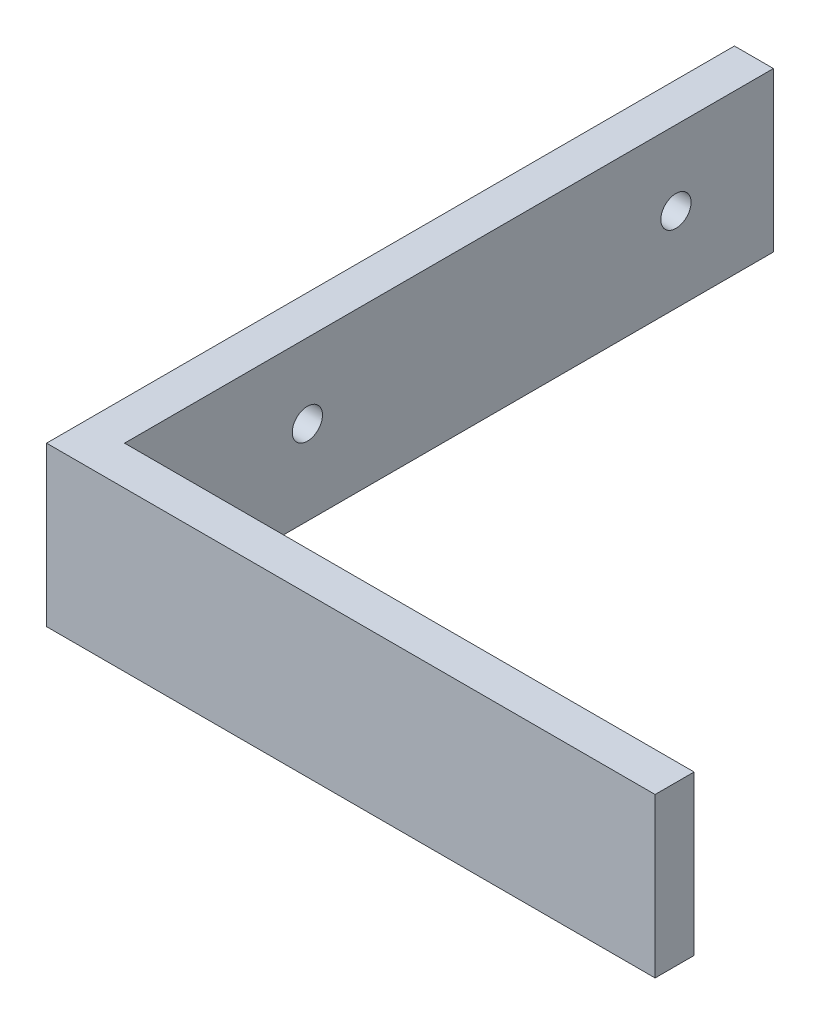
ISO-10303-21;
HEADER;
FILE_DESCRIPTION(('STEP AP214'),'2;1');
FILE_NAME('part.step','',(''),(''),'','','');
FILE_SCHEMA(('AUTOMOTIVE_DESIGN { 1 0 10303 214 1 1 1 1 }'));
ENDSEC;
DATA;
#1=APPLICATION_CONTEXT('core data for automotive mechanical design processes');
#2=APPLICATION_PROTOCOL_DEFINITION('international standard','automotive_design',2000,#1);
#3=PRODUCT_CONTEXT('',#1,'mechanical');
#4=PRODUCT('Part','Part','',(#3));
#5=PRODUCT_RELATED_PRODUCT_CATEGORY('part','',(#4));
#6=PRODUCT_DEFINITION_FORMATION('','',#4);
#7=PRODUCT_DEFINITION_CONTEXT('part definition',#1,'design');
#8=PRODUCT_DEFINITION('design','',#6,#7);
#9=PRODUCT_DEFINITION_SHAPE('','',#8);
#10=(LENGTH_UNIT() NAMED_UNIT(*) SI_UNIT(.MILLI.,.METRE.));
#11=(NAMED_UNIT(*) PLANE_ANGLE_UNIT() SI_UNIT($,.RADIAN.));
#12=(NAMED_UNIT(*) SI_UNIT($,.STERADIAN.) SOLID_ANGLE_UNIT());
#13=UNCERTAINTY_MEASURE_WITH_UNIT(LENGTH_MEASURE(1.E-05),#10,'distance_accuracy_value','');
#14=(GEOMETRIC_REPRESENTATION_CONTEXT(3) GLOBAL_UNCERTAINTY_ASSIGNED_CONTEXT((#13)) GLOBAL_UNIT_ASSIGNED_CONTEXT((#10,
#11,#12)) REPRESENTATION_CONTEXT('',''));
#15=CARTESIAN_POINT('',(0.,0.,0.));
#16=DIRECTION('',(0.,0.,1.));
#17=DIRECTION('',(1.,0.,0.));
#18=AXIS2_PLACEMENT_3D('',#15,#16,#17);
#19=CARTESIAN_POINT('',(-35.15,0.,4.));
#20=DIRECTION('',(1.,0.,0.));
#21=DIRECTION('',(0.,0.,-1.));
#22=AXIS2_PLACEMENT_3D('',#19,#20,#21);
#23=PLANE('',#22);
#24=DIRECTION('',(0.,0.,-1.));
#25=VECTOR('',#24,1.);
#26=CARTESIAN_POINT('',(-35.15,8.15,4.));
#27=LINE('',#26,#25);
#28=CARTESIAN_POINT('',(-35.15,8.15,4.));
#29=VERTEX_POINT('',#28);
#30=CARTESIAN_POINT('',(-35.15,8.14999999999999,-66.5500000000005));
#31=VERTEX_POINT('',#30);
#32=EDGE_CURVE('E115',#29,#31,#27,.T.);
#33=ORIENTED_EDGE('',*,*,#32,.T.);
#34=DIRECTION('',(0.,-1.,0.));
#35=VECTOR('',#34,1.);
#36=CARTESIAN_POINT('',(-35.15,8.14999999999999,-66.5500000000005));
#37=LINE('',#36,#35);
#38=CARTESIAN_POINT('',(-35.15,-8.15000000000001,-66.5500000000005));
#39=VERTEX_POINT('',#38);
#40=EDGE_CURVE('E145',#31,#39,#37,.T.);
#41=ORIENTED_EDGE('',*,*,#40,.T.);
#42=DIRECTION('',(0.,0.,-1.));
#43=VECTOR('',#42,1.);
#44=CARTESIAN_POINT('',(-35.15,-8.15,4.));
#45=LINE('',#44,#43);
#46=CARTESIAN_POINT('',(-35.15,-8.15,4.));
#47=VERTEX_POINT('',#46);
#48=EDGE_CURVE('E125',#47,#39,#45,.T.);
#49=ORIENTED_EDGE('',*,*,#48,.F.);
#50=DIRECTION('',(0.,-1.,0.));
#51=VECTOR('',#50,1.);
#52=CARTESIAN_POINT('',(-35.15,0.,4.));
#53=LINE('',#52,#51);
#54=EDGE_CURVE('E118',#29,#47,#53,.T.);
#55=ORIENTED_EDGE('',*,*,#54,.F.);
#56=EDGE_LOOP('',(#33,#41,#49,#55));
#57=FACE_BOUND('',#56,.T.);
#58=CARTESIAN_POINT('',(-35.15,0.499999999999778,-18.7500000000005));
#59=DIRECTION('',(-1.,0.,0.));
#60=DIRECTION('',(0.,0.,1.));
#61=AXIS2_PLACEMENT_3D('',#58,#59,#60);
#62=CIRCLE('',#61,1.55);
#63=CARTESIAN_POINT('',(-35.15,0.499999999999778,-17.2000000000005));
#64=VERTEX_POINT('',#63);
#65=EDGE_CURVE('E161',#64,#64,#62,.T.);
#66=ORIENTED_EDGE('',*,*,#65,.F.);
#67=EDGE_LOOP('',(#66));
#68=FACE_BOUND('',#67,.T.);
#69=CARTESIAN_POINT('',(-35.15,0.499999999999778,-56.5500000000005));
#70=DIRECTION('',(-1.,0.,0.));
#71=DIRECTION('',(0.,0.,1.));
#72=AXIS2_PLACEMENT_3D('',#69,#70,#71);
#73=CIRCLE('',#72,1.55);
#74=CARTESIAN_POINT('',(-35.15,0.499999999999778,-55.0000000000005));
#75=VERTEX_POINT('',#74);
#76=EDGE_CURVE('E155',#75,#75,#73,.T.);
#77=ORIENTED_EDGE('',*,*,#76,.F.);
#78=EDGE_LOOP('',(#77));
#79=FACE_BOUND('',#78,.T.);
#80=ADVANCED_FACE('F60',(#57,#68,#79),#23,.F.);
#81=CARTESIAN_POINT('',(27.2634,0.,4.));
#82=DIRECTION('',(-1.,0.,0.));
#83=DIRECTION('',(0.,0.,1.));
#84=AXIS2_PLACEMENT_3D('',#81,#82,#83);
#85=PLANE('',#84);
#86=DIRECTION('',(0.,1.,0.));
#87=VECTOR('',#86,1.);
#88=CARTESIAN_POINT('',(27.2634,0.,0.));
#89=LINE('',#88,#87);
#90=CARTESIAN_POINT('',(27.2634,-8.15,0.));
#91=VERTEX_POINT('',#90);
#92=CARTESIAN_POINT('',(27.2634,8.15000000000001,0.));
#93=VERTEX_POINT('',#92);
#94=EDGE_CURVE('E124',#91,#93,#89,.T.);
#95=ORIENTED_EDGE('',*,*,#94,.T.);
#96=DIRECTION('',(0.,0.,-1.));
#97=VECTOR('',#96,1.);
#98=CARTESIAN_POINT('',(27.2634,8.15000000000001,4.));
#99=LINE('',#98,#97);
#100=CARTESIAN_POINT('',(27.2634,8.15000000000001,4.));
#101=VERTEX_POINT('',#100);
#102=EDGE_CURVE('E69',#101,#93,#99,.T.);
#103=ORIENTED_EDGE('',*,*,#102,.F.);
#104=DIRECTION('',(0.,1.,0.));
#105=VECTOR('',#104,1.);
#106=CARTESIAN_POINT('',(27.2634,0.,4.));
#107=LINE('',#106,#105);
#108=CARTESIAN_POINT('',(27.2634,-8.15,4.));
#109=VERTEX_POINT('',#108);
#110=EDGE_CURVE('E119',#109,#101,#107,.T.);
#111=ORIENTED_EDGE('',*,*,#110,.F.);
#112=DIRECTION('',(0.,0.,-1.));
#113=VECTOR('',#112,1.);
#114=CARTESIAN_POINT('',(27.2634,-8.15,4.));
#115=LINE('',#114,#113);
#116=EDGE_CURVE('E12',#109,#91,#115,.T.);
#117=ORIENTED_EDGE('',*,*,#116,.T.);
#118=EDGE_LOOP('',(#95,#103,#111,#117));
#119=FACE_BOUND('',#118,.T.);
#120=ADVANCED_FACE('F123',(#119),#85,.F.);
#121=CARTESIAN_POINT('',(0.,8.15,4.));
#122=DIRECTION('',(0.,1.,0.));
#123=DIRECTION('',(-1.,0.,0.));
#124=AXIS2_PLACEMENT_3D('',#121,#122,#123);
#125=PLANE('',#124);
#126=DIRECTION('',(1.,0.,0.));
#127=VECTOR('',#126,1.);
#128=CARTESIAN_POINT('',(0.,8.15,0.));
#129=LINE('',#128,#127);
#130=CARTESIAN_POINT('',(-31.15,8.15,0.));
#131=VERTEX_POINT('',#130);
#132=EDGE_CURVE('E129',#131,#93,#129,.T.);
#133=ORIENTED_EDGE('',*,*,#132,.F.);
#134=DIRECTION('',(0.,0.,-1.));
#135=VECTOR('',#134,1.);
#136=CARTESIAN_POINT('',(-31.15,8.15,4.));
#137=LINE('',#136,#135);
#138=CARTESIAN_POINT('',(-31.15,8.14999999999999,-66.5500000000005));
#139=VERTEX_POINT('',#138);
#140=EDGE_CURVE('E98',#131,#139,#137,.T.);
#141=ORIENTED_EDGE('',*,*,#140,.T.);
#142=DIRECTION('',(-1.,0.,0.));
#143=VECTOR('',#142,1.);
#144=CARTESIAN_POINT('',(-31.15,8.14999999999999,-66.5500000000005));
#145=LINE('',#144,#143);
#146=EDGE_CURVE('E140',#139,#31,#145,.T.);
#147=ORIENTED_EDGE('',*,*,#146,.T.);
#148=ORIENTED_EDGE('',*,*,#32,.F.);
#149=DIRECTION('',(1.,0.,0.));
#150=VECTOR('',#149,1.);
#151=CARTESIAN_POINT('',(0.,8.15,4.));
#152=LINE('',#151,#150);
#153=EDGE_CURVE('E108',#29,#101,#152,.T.);
#154=ORIENTED_EDGE('',*,*,#153,.T.);
#155=ORIENTED_EDGE('',*,*,#102,.T.);
#156=EDGE_LOOP('',(#133,#141,#147,#148,#154,#155));
#157=FACE_BOUND('',#156,.T.);
#158=ADVANCED_FACE('F111',(#157),#125,.T.);
#159=CARTESIAN_POINT('',(0.,-8.15,4.));
#160=DIRECTION('',(0.,-1.,0.));
#161=DIRECTION('',(1.,0.,0.));
#162=AXIS2_PLACEMENT_3D('',#159,#160,#161);
#163=PLANE('',#162);
#164=DIRECTION('',(-1.,0.,0.));
#165=VECTOR('',#164,1.);
#166=CARTESIAN_POINT('',(0.,-8.15,4.));
#167=LINE('',#166,#165);
#168=EDGE_CURVE('E77',#109,#47,#167,.T.);
#169=ORIENTED_EDGE('',*,*,#168,.T.);
#170=ORIENTED_EDGE('',*,*,#48,.T.);
#171=DIRECTION('',(-1.,0.,0.));
#172=VECTOR('',#171,1.);
#173=CARTESIAN_POINT('',(-31.15,-8.15000000000001,-66.5500000000005));
#174=LINE('',#173,#172);
#175=CARTESIAN_POINT('',(-31.15,-8.15000000000001,-66.5500000000005));
#176=VERTEX_POINT('',#175);
#177=EDGE_CURVE('E139',#176,#39,#174,.T.);
#178=ORIENTED_EDGE('',*,*,#177,.F.);
#179=DIRECTION('',(0.,0.,1.));
#180=VECTOR('',#179,1.);
#181=CARTESIAN_POINT('',(-31.15,-8.15,4.));
#182=LINE('',#181,#180);
#183=CARTESIAN_POINT('',(-31.15,-8.15,0.));
#184=VERTEX_POINT('',#183);
#185=EDGE_CURVE('E142',#176,#184,#182,.T.);
#186=ORIENTED_EDGE('',*,*,#185,.T.);
#187=DIRECTION('',(-1.,0.,0.));
#188=VECTOR('',#187,1.);
#189=CARTESIAN_POINT('',(0.,-8.15,0.));
#190=LINE('',#189,#188);
#191=EDGE_CURVE('E132',#91,#184,#190,.T.);
#192=ORIENTED_EDGE('',*,*,#191,.F.);
#193=ORIENTED_EDGE('',*,*,#116,.F.);
#194=EDGE_LOOP('',(#169,#170,#178,#186,#192,#193));
#195=FACE_BOUND('',#194,.T.);
#196=ADVANCED_FACE('F62',(#195),#163,.T.);
#197=CARTESIAN_POINT('',(0.,0.,0.));
#198=DIRECTION('',(0.,0.,1.));
#199=DIRECTION('',(1.,0.,0.));
#200=AXIS2_PLACEMENT_3D('',#197,#198,#199);
#201=PLANE('',#200);
#202=ORIENTED_EDGE('',*,*,#191,.T.);
#203=DIRECTION('',(0.,1.,0.));
#204=VECTOR('',#203,1.);
#205=CARTESIAN_POINT('',(-31.15,0.,0.));
#206=LINE('',#205,#204);
#207=EDGE_CURVE('E135',#184,#131,#206,.T.);
#208=ORIENTED_EDGE('',*,*,#207,.T.);
#209=ORIENTED_EDGE('',*,*,#132,.T.);
#210=ORIENTED_EDGE('',*,*,#94,.F.);
#211=EDGE_LOOP('',(#202,#208,#209,#210));
#212=FACE_BOUND('',#211,.T.);
#213=ADVANCED_FACE('F198',(#212),#201,.F.);
#214=CARTESIAN_POINT('',(0.,0.,4.));
#215=DIRECTION('',(0.,0.,1.));
#216=DIRECTION('',(1.,0.,0.));
#217=AXIS2_PLACEMENT_3D('',#214,#215,#216);
#218=PLANE('',#217);
#219=ORIENTED_EDGE('',*,*,#110,.T.);
#220=ORIENTED_EDGE('',*,*,#153,.F.);
#221=ORIENTED_EDGE('',*,*,#54,.T.);
#222=ORIENTED_EDGE('',*,*,#168,.F.);
#223=EDGE_LOOP('',(#219,#220,#221,#222));
#224=FACE_BOUND('',#223,.T.);
#225=ADVANCED_FACE('F121',(#224),#218,.T.);
#226=CARTESIAN_POINT('',(-31.15,0.,0.));
#227=DIRECTION('',(1.,0.,0.));
#228=DIRECTION('',(0.,0.,-1.));
#229=AXIS2_PLACEMENT_3D('',#226,#227,#228);
#230=PLANE('',#229);
#231=CARTESIAN_POINT('',(-31.15,0.499999999999778,-56.5500000000005));
#232=DIRECTION('',(-1.,0.,0.));
#233=DIRECTION('',(0.,0.,1.));
#234=AXIS2_PLACEMENT_3D('',#231,#232,#233);
#235=CIRCLE('',#234,1.55);
#236=CARTESIAN_POINT('',(-31.15,0.499999999999778,-55.0000000000005));
#237=VERTEX_POINT('',#236);
#238=EDGE_CURVE('E148',#237,#237,#235,.T.);
#239=ORIENTED_EDGE('',*,*,#238,.T.);
#240=EDGE_LOOP('',(#239));
#241=FACE_BOUND('',#240,.T.);
#242=CARTESIAN_POINT('',(-31.15,0.499999999999778,-18.7500000000005));
#243=DIRECTION('',(-1.,0.,0.));
#244=DIRECTION('',(0.,0.,1.));
#245=AXIS2_PLACEMENT_3D('',#242,#243,#244);
#246=CIRCLE('',#245,1.55);
#247=CARTESIAN_POINT('',(-31.15,0.499999999999778,-17.2000000000005));
#248=VERTEX_POINT('',#247);
#249=EDGE_CURVE('E158',#248,#248,#246,.T.);
#250=ORIENTED_EDGE('',*,*,#249,.T.);
#251=EDGE_LOOP('',(#250));
#252=FACE_BOUND('',#251,.T.);
#253=ORIENTED_EDGE('',*,*,#207,.F.);
#254=ORIENTED_EDGE('',*,*,#185,.F.);
#255=DIRECTION('',(0.,-1.,0.));
#256=VECTOR('',#255,1.);
#257=CARTESIAN_POINT('',(-31.15,8.14999999999999,-66.5500000000005));
#258=LINE('',#257,#256);
#259=EDGE_CURVE('E151',#139,#176,#258,.T.);
#260=ORIENTED_EDGE('',*,*,#259,.F.);
#261=ORIENTED_EDGE('',*,*,#140,.F.);
#262=EDGE_LOOP('',(#253,#254,#260,#261));
#263=FACE_BOUND('',#262,.T.);
#264=ADVANCED_FACE('F167',(#241,#252,#263),#230,.T.);
#265=CARTESIAN_POINT('',(-31.15,8.14999999999999,-66.5500000000005));
#266=DIRECTION('',(0.,0.,-1.));
#267=DIRECTION('',(-1.,0.,0.));
#268=AXIS2_PLACEMENT_3D('',#265,#266,#267);
#269=PLANE('',#268);
#270=ORIENTED_EDGE('',*,*,#40,.F.);
#271=ORIENTED_EDGE('',*,*,#146,.F.);
#272=ORIENTED_EDGE('',*,*,#259,.T.);
#273=ORIENTED_EDGE('',*,*,#177,.T.);
#274=EDGE_LOOP('',(#270,#271,#272,#273));
#275=FACE_BOUND('',#274,.T.);
#276=ADVANCED_FACE('F183',(#275),#269,.T.);
#277=CARTESIAN_POINT('',(-31.15,0.499999999999778,-56.5500000000005));
#278=DIRECTION('',(-1.,0.,0.));
#279=DIRECTION('',(0.,0.,1.));
#280=AXIS2_PLACEMENT_3D('',#277,#278,#279);
#281=CYLINDRICAL_SURFACE('',#280,1.55);
#282=ORIENTED_EDGE('',*,*,#238,.F.);
#283=EDGE_LOOP('',(#282));
#284=FACE_BOUND('',#283,.T.);
#285=ORIENTED_EDGE('',*,*,#76,.T.);
#286=EDGE_LOOP('',(#285));
#287=FACE_BOUND('',#286,.T.);
#288=ADVANCED_FACE('F172',(#284,#287),#281,.F.);
#289=CARTESIAN_POINT('',(-31.15,0.499999999999778,-18.7500000000005));
#290=DIRECTION('',(-1.,0.,0.));
#291=DIRECTION('',(0.,0.,1.));
#292=AXIS2_PLACEMENT_3D('',#289,#290,#291);
#293=CYLINDRICAL_SURFACE('',#292,1.55);
#294=ORIENTED_EDGE('',*,*,#249,.F.);
#295=EDGE_LOOP('',(#294));
#296=FACE_BOUND('',#295,.T.);
#297=ORIENTED_EDGE('',*,*,#65,.T.);
#298=EDGE_LOOP('',(#297));
#299=FACE_BOUND('',#298,.T.);
#300=ADVANCED_FACE('F169',(#296,#299),#293,.F.);
#301=CLOSED_SHELL('',(#80,#120,#158,#196,#213,#225,#264,#276,#288,#300));
#302=MANIFOLD_SOLID_BREP('B2',#301);
#303=ADVANCED_BREP_SHAPE_REPRESENTATION('',(#18,#302),#14);
#304=SHAPE_DEFINITION_REPRESENTATION(#9,#303);
ENDSEC;
END-ISO-10303-21;
